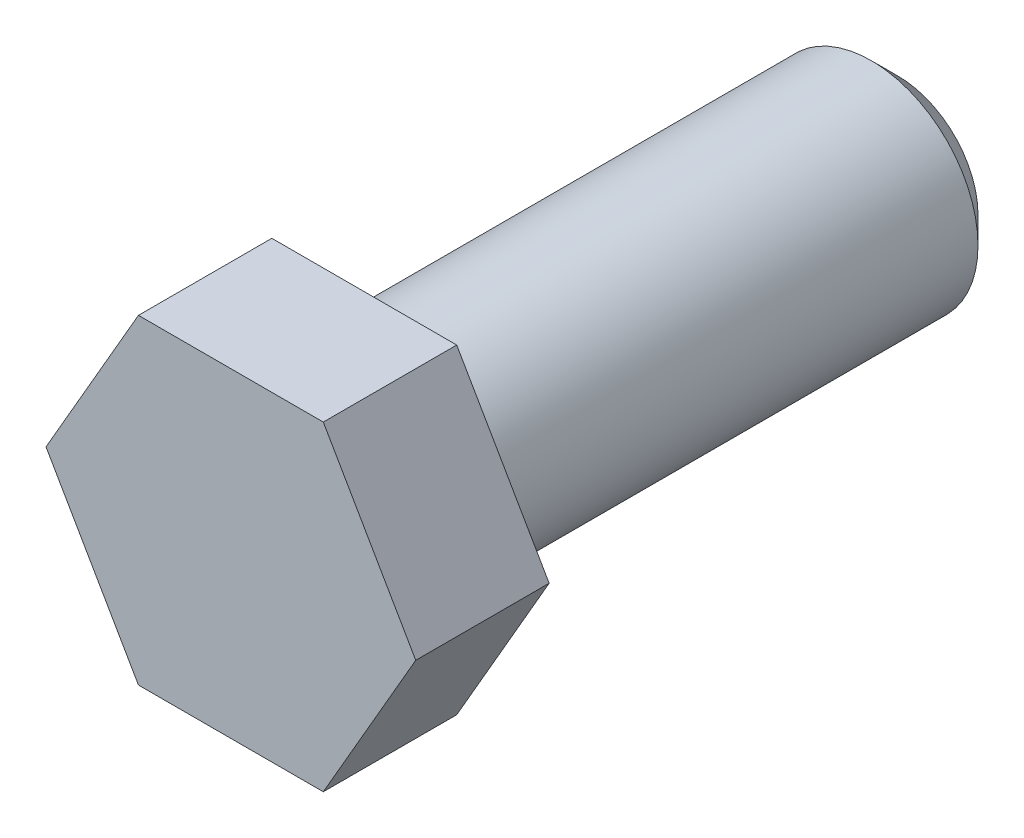
ISO-10303-21;
HEADER;
FILE_DESCRIPTION(('STEP AP214'),'2;1');
FILE_NAME('part.step','',(''),(''),'','','');
FILE_SCHEMA(('AUTOMOTIVE_DESIGN { 1 0 10303 214 1 1 1 1 }'));
ENDSEC;
DATA;
#1=APPLICATION_CONTEXT('core data for automotive mechanical design processes');
#2=APPLICATION_PROTOCOL_DEFINITION('international standard','automotive_design',2000,#1);
#3=PRODUCT_CONTEXT('',#1,'mechanical');
#4=PRODUCT('Part','Part','',(#3));
#5=PRODUCT_RELATED_PRODUCT_CATEGORY('part','',(#4));
#6=PRODUCT_DEFINITION_FORMATION('','',#4);
#7=PRODUCT_DEFINITION_CONTEXT('part definition',#1,'design');
#8=PRODUCT_DEFINITION('design','',#6,#7);
#9=PRODUCT_DEFINITION_SHAPE('','',#8);
#10=(LENGTH_UNIT() NAMED_UNIT(*) SI_UNIT(.MILLI.,.METRE.));
#11=(NAMED_UNIT(*) PLANE_ANGLE_UNIT() SI_UNIT($,.RADIAN.));
#12=(NAMED_UNIT(*) SI_UNIT($,.STERADIAN.) SOLID_ANGLE_UNIT());
#13=UNCERTAINTY_MEASURE_WITH_UNIT(LENGTH_MEASURE(1.E-05),#10,'distance_accuracy_value','');
#14=(GEOMETRIC_REPRESENTATION_CONTEXT(3) GLOBAL_UNCERTAINTY_ASSIGNED_CONTEXT((#13)) GLOBAL_UNIT_ASSIGNED_CONTEXT((#10,
#11,#12)) REPRESENTATION_CONTEXT('',''));
#15=CARTESIAN_POINT('',(0.,0.,0.));
#16=DIRECTION('',(0.,0.,1.));
#17=DIRECTION('',(1.,0.,0.));
#18=AXIS2_PLACEMENT_3D('',#15,#16,#17);
#19=CARTESIAN_POINT('',(-5.19615242270664,9.,0.));
#20=DIRECTION('',(0.,0.,1.));
#21=DIRECTION('',(1.,0.,0.));
#22=AXIS2_PLACEMENT_3D('',#19,#20,#21);
#23=PLANE('',#22);
#24=DIRECTION('',(-0.499999999999999,-0.866025403784439,0.));
#25=VECTOR('',#24,1.);
#26=CARTESIAN_POINT('',(-5.19615242270664,9.,0.));
#27=LINE('',#26,#25);
#28=CARTESIAN_POINT('',(-5.19615242270664,9.,0.));
#29=VERTEX_POINT('',#28);
#30=CARTESIAN_POINT('',(-10.3923048454133,0.,0.));
#31=VERTEX_POINT('',#30);
#32=EDGE_CURVE('E117',#29,#31,#27,.T.);
#33=ORIENTED_EDGE('',*,*,#32,.F.);
#34=DIRECTION('',(1.,0.,0.));
#35=VECTOR('',#34,1.);
#36=CARTESIAN_POINT('',(-5.19615242270664,9.,0.));
#37=LINE('',#36,#35);
#38=CARTESIAN_POINT('',(5.19615242270662,9.,0.));
#39=VERTEX_POINT('',#38);
#40=EDGE_CURVE('E127',#29,#39,#37,.T.);
#41=ORIENTED_EDGE('',*,*,#40,.T.);
#42=DIRECTION('',(0.5,-0.866025403784438,0.));
#43=VECTOR('',#42,1.);
#44=CARTESIAN_POINT('',(5.19615242270662,9.,0.));
#45=LINE('',#44,#43);
#46=CARTESIAN_POINT('',(10.3923048454133,0.,0.));
#47=VERTEX_POINT('',#46);
#48=EDGE_CURVE('E125',#39,#47,#45,.T.);
#49=ORIENTED_EDGE('',*,*,#48,.T.);
#50=DIRECTION('',(-0.499999999999999,-0.866025403784439,0.));
#51=VECTOR('',#50,1.);
#52=CARTESIAN_POINT('',(10.3923048454133,0.,0.));
#53=LINE('',#52,#51);
#54=CARTESIAN_POINT('',(5.19615242270663,-9.00000000000001,0.));
#55=VERTEX_POINT('',#54);
#56=EDGE_CURVE('E96',#47,#55,#53,.T.);
#57=ORIENTED_EDGE('',*,*,#56,.T.);
#58=DIRECTION('',(1.,0.,0.));
#59=VECTOR('',#58,1.);
#60=CARTESIAN_POINT('',(-5.19615242270663,-9.00000000000001,0.));
#61=LINE('',#60,#59);
#62=CARTESIAN_POINT('',(-5.19615242270663,-9.00000000000001,0.));
#63=VERTEX_POINT('',#62);
#64=EDGE_CURVE('E121',#63,#55,#61,.T.);
#65=ORIENTED_EDGE('',*,*,#64,.F.);
#66=DIRECTION('',(0.5,-0.866025403784439,0.));
#67=VECTOR('',#66,1.);
#68=CARTESIAN_POINT('',(-10.3923048454133,0.,0.));
#69=LINE('',#68,#67);
#70=EDGE_CURVE('E119',#31,#63,#69,.T.);
#71=ORIENTED_EDGE('',*,*,#70,.F.);
#72=EDGE_LOOP('',(#33,#41,#49,#57,#65,#71));
#73=FACE_BOUND('',#72,.T.);
#74=CARTESIAN_POINT('',(0.,0.,0.));
#75=DIRECTION('',(0.,0.,1.));
#76=DIRECTION('',(1.,0.,0.));
#77=AXIS2_PLACEMENT_3D('',#74,#75,#76);
#78=CIRCLE('',#77,6.);
#79=CARTESIAN_POINT('',(6.,0.,0.));
#80=VERTEX_POINT('',#79);
#81=EDGE_CURVE('E139',#80,#80,#78,.F.);
#82=ORIENTED_EDGE('',*,*,#81,.F.);
#83=EDGE_LOOP('',(#82));
#84=FACE_BOUND('',#83,.T.);
#85=ADVANCED_FACE('F31',(#73,#84),#23,.F.);
#86=CARTESIAN_POINT('',(-5.19615242270664,9.,7.5));
#87=DIRECTION('',(0.866025403784439,-0.499999999999999,0.));
#88=DIRECTION('',(0.499999999999999,0.866025403784439,0.));
#89=AXIS2_PLACEMENT_3D('',#86,#87,#88);
#90=PLANE('',#89);
#91=ORIENTED_EDGE('',*,*,#32,.T.);
#92=DIRECTION('',(0.,0.,-1.));
#93=VECTOR('',#92,1.);
#94=CARTESIAN_POINT('',(-10.3923048454133,0.,7.5));
#95=LINE('',#94,#93);
#96=CARTESIAN_POINT('',(-10.3923048454133,0.,7.5));
#97=VERTEX_POINT('',#96);
#98=EDGE_CURVE('E137',#97,#31,#95,.T.);
#99=ORIENTED_EDGE('',*,*,#98,.F.);
#100=DIRECTION('',(-0.499999999999999,-0.866025403784439,0.));
#101=VECTOR('',#100,1.);
#102=CARTESIAN_POINT('',(-5.19615242270664,9.,7.5));
#103=LINE('',#102,#101);
#104=CARTESIAN_POINT('',(-5.19615242270664,9.,7.5));
#105=VERTEX_POINT('',#104);
#106=EDGE_CURVE('E130',#105,#97,#103,.T.);
#107=ORIENTED_EDGE('',*,*,#106,.F.);
#108=DIRECTION('',(0.,0.,-1.));
#109=VECTOR('',#108,1.);
#110=CARTESIAN_POINT('',(-5.19615242270664,9.,7.5));
#111=LINE('',#110,#109);
#112=EDGE_CURVE('E48',#105,#29,#111,.T.);
#113=ORIENTED_EDGE('',*,*,#112,.T.);
#114=EDGE_LOOP('',(#91,#99,#107,#113));
#115=FACE_BOUND('',#114,.T.);
#116=ADVANCED_FACE('F155',(#115),#90,.F.);
#117=CARTESIAN_POINT('',(-10.3923048454133,0.,7.5));
#118=DIRECTION('',(0.866025403784439,0.5,0.));
#119=DIRECTION('',(-0.5,0.866025403784439,0.));
#120=AXIS2_PLACEMENT_3D('',#117,#118,#119);
#121=PLANE('',#120);
#122=ORIENTED_EDGE('',*,*,#70,.T.);
#123=DIRECTION('',(0.,0.,-1.));
#124=VECTOR('',#123,1.);
#125=CARTESIAN_POINT('',(-5.19615242270663,-9.00000000000001,7.5));
#126=LINE('',#125,#124);
#127=CARTESIAN_POINT('',(-5.19615242270663,-9.00000000000001,7.5));
#128=VERTEX_POINT('',#127);
#129=EDGE_CURVE('E134',#128,#63,#126,.T.);
#130=ORIENTED_EDGE('',*,*,#129,.F.);
#131=DIRECTION('',(0.5,-0.866025403784439,0.));
#132=VECTOR('',#131,1.);
#133=CARTESIAN_POINT('',(-10.3923048454133,0.,7.5));
#134=LINE('',#133,#132);
#135=EDGE_CURVE('E81',#97,#128,#134,.T.);
#136=ORIENTED_EDGE('',*,*,#135,.F.);
#137=ORIENTED_EDGE('',*,*,#98,.T.);
#138=EDGE_LOOP('',(#122,#130,#136,#137));
#139=FACE_BOUND('',#138,.T.);
#140=ADVANCED_FACE('F161',(#139),#121,.F.);
#141=CARTESIAN_POINT('',(-5.19615242270663,-9.00000000000001,7.5));
#142=DIRECTION('',(0.,1.,0.));
#143=DIRECTION('',(0.,0.,1.));
#144=AXIS2_PLACEMENT_3D('',#141,#142,#143);
#145=PLANE('',#144);
#146=ORIENTED_EDGE('',*,*,#64,.T.);
#147=DIRECTION('',(0.,0.,-1.));
#148=VECTOR('',#147,1.);
#149=CARTESIAN_POINT('',(5.19615242270663,-9.00000000000001,7.5));
#150=LINE('',#149,#148);
#151=CARTESIAN_POINT('',(5.19615242270663,-9.00000000000001,7.5));
#152=VERTEX_POINT('',#151);
#153=EDGE_CURVE('E100',#152,#55,#150,.T.);
#154=ORIENTED_EDGE('',*,*,#153,.F.);
#155=DIRECTION('',(1.,0.,0.));
#156=VECTOR('',#155,1.);
#157=CARTESIAN_POINT('',(-5.19615242270663,-9.00000000000001,7.5));
#158=LINE('',#157,#156);
#159=EDGE_CURVE('E108',#128,#152,#158,.T.);
#160=ORIENTED_EDGE('',*,*,#159,.F.);
#161=ORIENTED_EDGE('',*,*,#129,.T.);
#162=EDGE_LOOP('',(#146,#154,#160,#161));
#163=FACE_BOUND('',#162,.T.);
#164=ADVANCED_FACE('F173',(#163),#145,.F.);
#165=CARTESIAN_POINT('',(10.3923048454133,0.,7.5));
#166=DIRECTION('',(0.866025403784439,-0.499999999999999,0.));
#167=DIRECTION('',(0.499999999999999,0.866025403784439,0.));
#168=AXIS2_PLACEMENT_3D('',#165,#166,#167);
#169=PLANE('',#168);
#170=ORIENTED_EDGE('',*,*,#56,.F.);
#171=DIRECTION('',(0.,0.,-1.));
#172=VECTOR('',#171,1.);
#173=CARTESIAN_POINT('',(10.3923048454133,0.,7.5));
#174=LINE('',#173,#172);
#175=CARTESIAN_POINT('',(10.3923048454133,0.,7.5));
#176=VERTEX_POINT('',#175);
#177=EDGE_CURVE('E91',#176,#47,#174,.T.);
#178=ORIENTED_EDGE('',*,*,#177,.F.);
#179=DIRECTION('',(-0.499999999999999,-0.866025403784439,0.));
#180=VECTOR('',#179,1.);
#181=CARTESIAN_POINT('',(10.3923048454133,0.,7.5));
#182=LINE('',#181,#180);
#183=EDGE_CURVE('E94',#176,#152,#182,.T.);
#184=ORIENTED_EDGE('',*,*,#183,.T.);
#185=ORIENTED_EDGE('',*,*,#153,.T.);
#186=EDGE_LOOP('',(#170,#178,#184,#185));
#187=FACE_BOUND('',#186,.T.);
#188=ADVANCED_FACE('F93',(#187),#169,.T.);
#189=CARTESIAN_POINT('',(5.19615242270662,9.,7.5));
#190=DIRECTION('',(0.866025403784438,0.5,0.));
#191=DIRECTION('',(-0.5,0.866025403784439,0.));
#192=AXIS2_PLACEMENT_3D('',#189,#190,#191);
#193=PLANE('',#192);
#194=ORIENTED_EDGE('',*,*,#48,.F.);
#195=DIRECTION('',(0.,0.,-1.));
#196=VECTOR('',#195,1.);
#197=CARTESIAN_POINT('',(5.19615242270662,9.,7.5));
#198=LINE('',#197,#196);
#199=CARTESIAN_POINT('',(5.19615242270662,9.,7.5));
#200=VERTEX_POINT('',#199);
#201=EDGE_CURVE('E68',#200,#39,#198,.T.);
#202=ORIENTED_EDGE('',*,*,#201,.F.);
#203=DIRECTION('',(0.5,-0.866025403784438,0.));
#204=VECTOR('',#203,1.);
#205=CARTESIAN_POINT('',(5.19615242270662,9.,7.5));
#206=LINE('',#205,#204);
#207=EDGE_CURVE('E106',#200,#176,#206,.T.);
#208=ORIENTED_EDGE('',*,*,#207,.T.);
#209=ORIENTED_EDGE('',*,*,#177,.T.);
#210=EDGE_LOOP('',(#194,#202,#208,#209));
#211=FACE_BOUND('',#210,.T.);
#212=ADVANCED_FACE('F111',(#211),#193,.T.);
#213=CARTESIAN_POINT('',(-5.19615242270664,9.,7.5));
#214=DIRECTION('',(0.,1.,0.));
#215=DIRECTION('',(0.,0.,1.));
#216=AXIS2_PLACEMENT_3D('',#213,#214,#215);
#217=PLANE('',#216);
#218=ORIENTED_EDGE('',*,*,#40,.F.);
#219=ORIENTED_EDGE('',*,*,#112,.F.);
#220=DIRECTION('',(1.,0.,0.));
#221=VECTOR('',#220,1.);
#222=CARTESIAN_POINT('',(-5.19615242270664,9.,7.5));
#223=LINE('',#222,#221);
#224=EDGE_CURVE('E112',#105,#200,#223,.T.);
#225=ORIENTED_EDGE('',*,*,#224,.T.);
#226=ORIENTED_EDGE('',*,*,#201,.T.);
#227=EDGE_LOOP('',(#218,#219,#225,#226));
#228=FACE_BOUND('',#227,.T.);
#229=ADVANCED_FACE('F166',(#228),#217,.T.);
#230=CARTESIAN_POINT('',(-5.19615242270664,9.,7.5));
#231=DIRECTION('',(0.,0.,1.));
#232=DIRECTION('',(1.,0.,0.));
#233=AXIS2_PLACEMENT_3D('',#230,#231,#232);
#234=PLANE('',#233);
#235=ORIENTED_EDGE('',*,*,#106,.T.);
#236=ORIENTED_EDGE('',*,*,#135,.T.);
#237=ORIENTED_EDGE('',*,*,#159,.T.);
#238=ORIENTED_EDGE('',*,*,#183,.F.);
#239=ORIENTED_EDGE('',*,*,#207,.F.);
#240=ORIENTED_EDGE('',*,*,#224,.F.);
#241=EDGE_LOOP('',(#235,#236,#237,#238,#239,#240));
#242=FACE_BOUND('',#241,.T.);
#243=ADVANCED_FACE('F104',(#242),#234,.T.);
#244=CARTESIAN_POINT('',(0.,0.,-30.));
#245=DIRECTION('',(0.,0.,1.));
#246=DIRECTION('',(1.,0.,0.));
#247=AXIS2_PLACEMENT_3D('',#244,#245,#246);
#248=CYLINDRICAL_SURFACE('',#247,6.);
#249=CARTESIAN_POINT('',(0.,0.,-28.5));
#250=DIRECTION('',(0.,0.,-1.));
#251=DIRECTION('',(-1.,0.,0.));
#252=AXIS2_PLACEMENT_3D('',#249,#250,#251);
#253=CIRCLE('',#252,6.);
#254=CARTESIAN_POINT('',(6.,0.,-28.5));
#255=VERTEX_POINT('',#254);
#256=EDGE_CURVE('E11',#255,#255,#253,.F.);
#257=ORIENTED_EDGE('',*,*,#256,.T.);
#258=EDGE_LOOP('',(#257));
#259=FACE_BOUND('',#258,.T.);
#260=ORIENTED_EDGE('',*,*,#81,.T.);
#261=EDGE_LOOP('',(#260));
#262=FACE_BOUND('',#261,.T.);
#263=ADVANCED_FACE('F151',(#259,#262),#248,.T.);
#264=CARTESIAN_POINT('',(0.,0.,-30.));
#265=DIRECTION('',(0.,0.,-1.));
#266=DIRECTION('',(-1.,0.,0.));
#267=AXIS2_PLACEMENT_3D('',#264,#265,#266);
#268=PLANE('',#267);
#269=CARTESIAN_POINT('',(0.,0.,-30.));
#270=DIRECTION('',(0.,0.,-1.));
#271=DIRECTION('',(-1.,0.,0.));
#272=AXIS2_PLACEMENT_3D('',#269,#270,#271);
#273=CIRCLE('',#272,4.49999999999997);
#274=CARTESIAN_POINT('',(4.49999999999998,0.,-30.));
#275=VERTEX_POINT('',#274);
#276=EDGE_CURVE('E40',#275,#275,#273,.T.);
#277=ORIENTED_EDGE('',*,*,#276,.T.);
#278=EDGE_LOOP('',(#277));
#279=FACE_BOUND('',#278,.T.);
#280=ADVANCED_FACE('F144',(#279),#268,.T.);
#281=CARTESIAN_POINT('',(0.,0.,-30.));
#282=DIRECTION('',(0.,0.,1.));
#283=DIRECTION('',(1.,0.,0.));
#284=AXIS2_PLACEMENT_3D('',#281,#282,#283);
#285=CONICAL_SURFACE('',#284,4.49999999999997,0.785398163397453);
#286=CARTESIAN_POINT('',(6.,0.,-28.5));
#287=CARTESIAN_POINT('',(5.984375,0.,-28.515625));
#288=CARTESIAN_POINT('',(5.96875,0.,-28.53125));
#289=CARTESIAN_POINT('',(5.9375,0.,-28.5625));
#290=CARTESIAN_POINT('',(5.921875,0.,-28.578125));
#291=CARTESIAN_POINT('',(5.890625,0.,-28.609375));
#292=CARTESIAN_POINT('',(5.875,0.,-28.625));
#293=CARTESIAN_POINT('',(5.84375,0.,-28.65625));
#294=CARTESIAN_POINT('',(5.828125,0.,-28.671875));
#295=CARTESIAN_POINT('',(5.796875,0.,-28.703125));
#296=CARTESIAN_POINT('',(5.78125,0.,-28.71875));
#297=CARTESIAN_POINT('',(5.75,0.,-28.75));
#298=CARTESIAN_POINT('',(5.734375,0.,-28.765625));
#299=CARTESIAN_POINT('',(5.703125,0.,-28.796875));
#300=CARTESIAN_POINT('',(5.6875,0.,-28.8125));
#301=CARTESIAN_POINT('',(5.65625,0.,-28.84375));
#302=CARTESIAN_POINT('',(5.640625,0.,-28.859375));
#303=CARTESIAN_POINT('',(5.609375,0.,-28.890625));
#304=CARTESIAN_POINT('',(5.59375,0.,-28.90625));
#305=CARTESIAN_POINT('',(5.5625,0.,-28.9375));
#306=CARTESIAN_POINT('',(5.54687499999999,0.,-28.953125));
#307=CARTESIAN_POINT('',(5.51562499999999,0.,-28.984375));
#308=CARTESIAN_POINT('',(5.49999999999999,0.,-29.));
#309=CARTESIAN_POINT('',(5.46874999999999,0.,-29.03125));
#310=CARTESIAN_POINT('',(5.45312499999999,0.,-29.046875));
#311=CARTESIAN_POINT('',(5.42187499999999,0.,-29.078125));
#312=CARTESIAN_POINT('',(5.40624999999999,0.,-29.09375));
#313=CARTESIAN_POINT('',(5.37499999999999,0.,-29.125));
#314=CARTESIAN_POINT('',(5.35937499999999,0.,-29.140625));
#315=CARTESIAN_POINT('',(5.32812499999999,0.,-29.171875));
#316=CARTESIAN_POINT('',(5.31249999999999,0.,-29.1875));
#317=CARTESIAN_POINT('',(5.28124999999999,0.,-29.21875));
#318=CARTESIAN_POINT('',(5.26562499999999,0.,-29.234375));
#319=CARTESIAN_POINT('',(5.23437499999999,0.,-29.265625));
#320=CARTESIAN_POINT('',(5.21874999999999,0.,-29.28125));
#321=CARTESIAN_POINT('',(5.18749999999999,0.,-29.3125));
#322=CARTESIAN_POINT('',(5.17187499999999,0.,-29.328125));
#323=CARTESIAN_POINT('',(5.14062499999999,0.,-29.359375));
#324=CARTESIAN_POINT('',(5.12499999999999,0.,-29.375));
#325=CARTESIAN_POINT('',(5.09374999999999,0.,-29.40625));
#326=CARTESIAN_POINT('',(5.07812499999999,0.,-29.421875));
#327=CARTESIAN_POINT('',(5.04687499999999,0.,-29.453125));
#328=CARTESIAN_POINT('',(5.03124999999999,0.,-29.46875));
#329=CARTESIAN_POINT('',(4.99999999999999,0.,-29.5));
#330=CARTESIAN_POINT('',(4.98437499999999,0.,-29.515625));
#331=CARTESIAN_POINT('',(4.95312499999998,0.,-29.546875));
#332=CARTESIAN_POINT('',(4.93749999999998,0.,-29.5625));
#333=CARTESIAN_POINT('',(4.90624999999998,0.,-29.59375));
#334=CARTESIAN_POINT('',(4.89062499999998,0.,-29.609375));
#335=CARTESIAN_POINT('',(4.85937499999998,0.,-29.640625));
#336=CARTESIAN_POINT('',(4.84374999999998,0.,-29.65625));
#337=CARTESIAN_POINT('',(4.81249999999998,0.,-29.6875));
#338=CARTESIAN_POINT('',(4.79687499999998,0.,-29.703125));
#339=CARTESIAN_POINT('',(4.76562499999998,0.,-29.734375));
#340=CARTESIAN_POINT('',(4.74999999999998,0.,-29.75));
#341=CARTESIAN_POINT('',(4.71874999999998,0.,-29.78125));
#342=CARTESIAN_POINT('',(4.70312499999998,0.,-29.796875));
#343=CARTESIAN_POINT('',(4.67187499999998,0.,-29.828125));
#344=CARTESIAN_POINT('',(4.65624999999998,0.,-29.84375));
#345=CARTESIAN_POINT('',(4.62499999999998,0.,-29.875));
#346=CARTESIAN_POINT('',(4.60937499999998,0.,-29.890625));
#347=CARTESIAN_POINT('',(4.57812499999998,0.,-29.921875));
#348=CARTESIAN_POINT('',(4.56249999999998,0.,-29.9375));
#349=CARTESIAN_POINT('',(4.53124999999998,0.,-29.96875));
#350=CARTESIAN_POINT('',(4.51562499999998,0.,-29.984375));
#351=CARTESIAN_POINT('',(4.49999999999998,0.,-30.));
#352=B_SPLINE_CURVE_WITH_KNOTS('',3,(#286,#287,#288,#289,#290,#291,#292,#293,#294,#295,#296,
#297,#298,#299,#300,#301,#302,#303,#304,#305,#306,#307,#308,#309,#310,#311,#312,#313,#314,#315,
#316,#317,#318,#319,#320,#321,#322,#323,#324,#325,#326,#327,#328,#329,#330,#331,#332,#333,#334,
#335,#336,#337,#338,#339,#340,#341,#342,#343,#344,#345,#346,#347,#348,#349,#350,#351),
.UNSPECIFIED.,.F.,.F.,(4,2,2,2,2,2,2,2,2,2,2,2,2,2,2,2,2,2,2,2,2,2,2,2,2,2,2,2,2,2,2,2,4),(0.,
0.0662912607362383,0.132582521472478,0.198873782208717,0.265165042944957,0.331456303681199,
0.397747564417436,0.464038825153677,0.530330085889915,0.596621346626156,0.662912607362395,
0.729203868098635,0.795495128834876,0.861786389571114,0.928077650307355,0.994368911043593,
1.06066017177983,1.12695143251607,1.19324269325231,1.25953395398855,1.32582521472479,
1.39211647546103,1.45840773619727,1.52469899693351,1.59099025766975,1.65728151840599,
1.72357277914223,1.78986403987847,1.85615530061471,1.92244656135095,1.98873782208719,
2.05502908282343,2.12132034355967),.UNSPECIFIED.);
#353=EDGE_CURVE('BSEAM33',#255,#275,#352,.T.);
#354=ORIENTED_EDGE('',*,*,#256,.F.);
#355=ORIENTED_EDGE('',*,*,#276,.F.);
#356=ORIENTED_EDGE('',*,*,#353,.T.);
#357=ORIENTED_EDGE('',*,*,#353,.F.);
#358=EDGE_LOOP('',(#354,#356,#355,#357));
#359=FACE_BOUND('',#358,.T.);
#360=ADVANCED_FACE('F33',(#359),#285,.T.);
#361=CLOSED_SHELL('',(#85,#116,#140,#164,#188,#212,#229,#243,#263,#280,#360));
#362=MANIFOLD_SOLID_BREP('B2',#361);
#363=ADVANCED_BREP_SHAPE_REPRESENTATION('',(#18,#362),#14);
#364=SHAPE_DEFINITION_REPRESENTATION(#9,#363);
ENDSEC;
END-ISO-10303-21;
